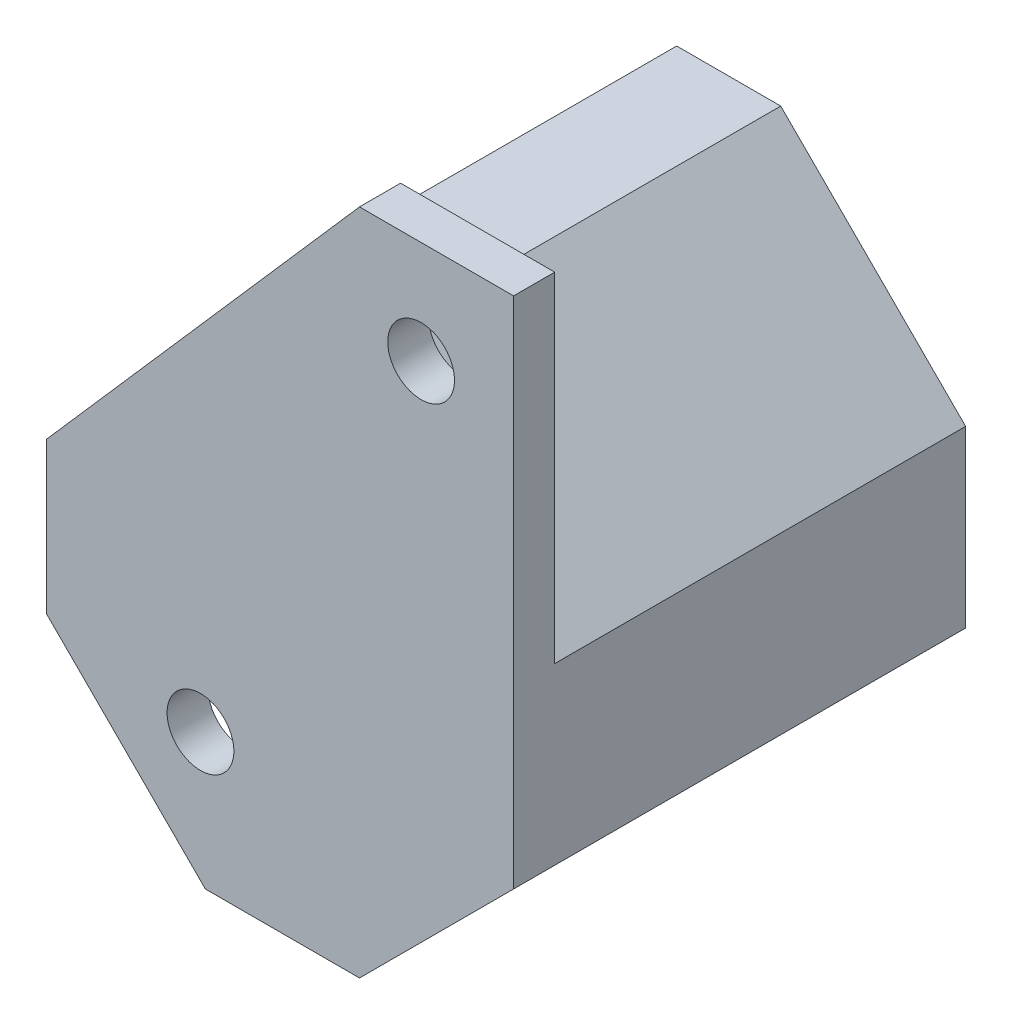
ISO-10303-21;
HEADER;
FILE_DESCRIPTION(('STEP AP214'),'2;1');
FILE_NAME('part.step','',(''),(''),'','','');
FILE_SCHEMA(('AUTOMOTIVE_DESIGN { 1 0 10303 214 1 1 1 1 }'));
ENDSEC;
DATA;
#1=APPLICATION_CONTEXT('core data for automotive mechanical design processes');
#2=APPLICATION_PROTOCOL_DEFINITION('international standard','automotive_design',2000,#1);
#3=PRODUCT_CONTEXT('',#1,'mechanical');
#4=PRODUCT('Part','Part','',(#3));
#5=PRODUCT_RELATED_PRODUCT_CATEGORY('part','',(#4));
#6=PRODUCT_DEFINITION_FORMATION('','',#4);
#7=PRODUCT_DEFINITION_CONTEXT('part definition',#1,'design');
#8=PRODUCT_DEFINITION('design','',#6,#7);
#9=PRODUCT_DEFINITION_SHAPE('','',#8);
#10=(LENGTH_UNIT() NAMED_UNIT(*) SI_UNIT(.MILLI.,.METRE.));
#11=(NAMED_UNIT(*) PLANE_ANGLE_UNIT() SI_UNIT($,.RADIAN.));
#12=(NAMED_UNIT(*) SI_UNIT($,.STERADIAN.) SOLID_ANGLE_UNIT());
#13=UNCERTAINTY_MEASURE_WITH_UNIT(LENGTH_MEASURE(1.E-05),#10,'distance_accuracy_value','');
#14=(GEOMETRIC_REPRESENTATION_CONTEXT(3) GLOBAL_UNCERTAINTY_ASSIGNED_CONTEXT((#13)) GLOBAL_UNIT_ASSIGNED_CONTEXT((#10,
#11,#12)) REPRESENTATION_CONTEXT('',''));
#15=CARTESIAN_POINT('',(0.,0.,0.));
#16=DIRECTION('',(0.,0.,1.));
#17=DIRECTION('',(1.,0.,0.));
#18=AXIS2_PLACEMENT_3D('',#15,#16,#17);
#19=CARTESIAN_POINT('',(-13.841173909257,-78.8343739809079,4.));
#20=DIRECTION('',(0.,-1.,0.));
#21=DIRECTION('',(0.,0.,1.));
#22=AXIS2_PLACEMENT_3D('',#19,#20,#21);
#23=PLANE('',#22);
#24=DIRECTION('',(0.,0.,-1.));
#25=VECTOR('',#24,1.);
#26=CARTESIAN_POINT('',(21.158826090743,-78.8343739809079,4.));
#27=LINE('',#26,#25);
#28=CARTESIAN_POINT('',(21.158826090743,-78.8343739809079,4.));
#29=VERTEX_POINT('',#28);
#30=CARTESIAN_POINT('',(21.158826090743,-78.8343739809079,0.));
#31=VERTEX_POINT('',#30);
#32=EDGE_CURVE('E385',#29,#31,#27,.T.);
#33=ORIENTED_EDGE('',*,*,#32,.F.);
#34=DIRECTION('',(1.,0.,0.));
#35=VECTOR('',#34,1.);
#36=CARTESIAN_POINT('',(-13.841173909257,-78.8343739809079,4.));
#37=LINE('',#36,#35);
#38=CARTESIAN_POINT('',(6.15882609074331,-78.8343739809079,4.));
#39=VERTEX_POINT('',#38);
#40=EDGE_CURVE('E355',#39,#29,#37,.T.);
#41=ORIENTED_EDGE('',*,*,#40,.F.);
#42=DIRECTION('',(0.,0.,1.));
#43=VECTOR('',#42,1.);
#44=CARTESIAN_POINT('',(6.15882609074331,-78.8343739809079,4.));
#45=LINE('',#44,#43);
#46=CARTESIAN_POINT('',(6.15882609074331,-78.8343739809079,0.));
#47=VERTEX_POINT('',#46);
#48=EDGE_CURVE('E369',#47,#39,#45,.T.);
#49=ORIENTED_EDGE('',*,*,#48,.F.);
#50=DIRECTION('',(-1.,0.,0.));
#51=VECTOR('',#50,1.);
#52=CARTESIAN_POINT('',(-13.841173909257,-78.8343739809079,0.));
#53=LINE('',#52,#51);
#54=EDGE_CURVE('E237',#31,#47,#53,.T.);
#55=ORIENTED_EDGE('',*,*,#54,.F.);
#56=EDGE_LOOP('',(#33,#41,#49,#55));
#57=FACE_BOUND('',#56,.T.);
#58=ADVANCED_FACE('F35',(#57),#23,.T.);
#59=CARTESIAN_POINT('',(-13.841173909257,-58.8343739809077,4.));
#60=DIRECTION('',(0.707106781186544,0.707106781186551,0.));
#61=DIRECTION('',(0.,0.,-1.));
#62=AXIS2_PLACEMENT_3D('',#59,#60,#61);
#63=PLANE('',#62);
#64=DIRECTION('',(0.,0.,1.));
#65=VECTOR('',#64,1.);
#66=CARTESIAN_POINT('',(-9.32054189023436,-63.3550059999304,4.));
#67=LINE('',#66,#65);
#68=CARTESIAN_POINT('',(-9.32054189023436,-63.3550059999304,4.));
#69=VERTEX_POINT('',#68);
#70=CARTESIAN_POINT('',(-9.32054189023436,-63.3550059999304,0.));
#71=VERTEX_POINT('',#70);
#72=EDGE_CURVE('E207',#69,#71,#67,.F.);
#73=ORIENTED_EDGE('',*,*,#72,.T.);
#74=DIRECTION('',(0.707106781186551,-0.707106781186544,0.));
#75=VECTOR('',#74,1.);
#76=CARTESIAN_POINT('',(-13.841173909257,-58.8343739809077,0.));
#77=LINE('',#76,#75);
#78=EDGE_CURVE('E245',#47,#71,#77,.F.);
#79=ORIENTED_EDGE('',*,*,#78,.F.);
#80=ORIENTED_EDGE('',*,*,#48,.T.);
#81=DIRECTION('',(0.707106781186551,-0.707106781186544,0.));
#82=VECTOR('',#81,1.);
#83=CARTESIAN_POINT('',(-13.841173909257,-58.8343739809077,4.));
#84=LINE('',#83,#82);
#85=EDGE_CURVE('E374',#39,#69,#84,.F.);
#86=ORIENTED_EDGE('',*,*,#85,.T.);
#87=EDGE_LOOP('',(#73,#79,#80,#86));
#88=FACE_BOUND('',#87,.T.);
#89=ADVANCED_FACE('F413',(#88),#63,.F.);
#90=CARTESIAN_POINT('',(21.158826090743,-13.8343739809079,4.));
#91=DIRECTION('',(-0.752576694706878,0.658504607868518,0.));
#92=DIRECTION('',(0.658504607868518,0.752576694706878,0.));
#93=AXIS2_PLACEMENT_3D('',#90,#91,#92);
#94=PLANE('',#93);
#95=DIRECTION('',(0.,0.,1.));
#96=VECTOR('',#95,1.);
#97=CARTESIAN_POINT('',(-9.32054189023436,-48.6679373877391,4.));
#98=LINE('',#97,#96);
#99=CARTESIAN_POINT('',(-9.32054189023436,-48.6679373877391,-40.));
#100=VERTEX_POINT('',#99);
#101=CARTESIAN_POINT('',(-9.32054189023436,-48.6679373877391,4.));
#102=VERTEX_POINT('',#101);
#103=EDGE_CURVE('E205',#100,#102,#98,.T.);
#104=ORIENTED_EDGE('',*,*,#103,.T.);
#105=DIRECTION('',(-0.658504607868518,-0.752576694706878,0.));
#106=VECTOR('',#105,1.);
#107=CARTESIAN_POINT('',(21.158826090743,-13.8343739809079,4.));
#108=LINE('',#107,#106);
#109=CARTESIAN_POINT('',(21.158826090743,-13.8343739809079,4.));
#110=VERTEX_POINT('',#109);
#111=EDGE_CURVE('E214',#110,#102,#108,.T.);
#112=ORIENTED_EDGE('',*,*,#111,.F.);
#113=DIRECTION('',(0.,0.,-1.));
#114=VECTOR('',#113,1.);
#115=CARTESIAN_POINT('',(21.158826090743,-13.8343739809079,4.));
#116=LINE('',#115,#114);
#117=CARTESIAN_POINT('',(21.158826090743,-13.8343739809079,0.));
#118=VERTEX_POINT('',#117);
#119=EDGE_CURVE('E367',#110,#118,#116,.T.);
#120=ORIENTED_EDGE('',*,*,#119,.T.);
#121=DIRECTION('',(-0.658504607868518,-0.752576694706878,0.));
#122=VECTOR('',#121,1.);
#123=CARTESIAN_POINT('',(21.158826090743,-13.8343739809079,0.));
#124=LINE('',#123,#122);
#125=CARTESIAN_POINT('',(8.03382609074297,-28.8343739809079,0.));
#126=VERTEX_POINT('',#125);
#127=EDGE_CURVE('E359',#118,#126,#124,.T.);
#128=ORIENTED_EDGE('',*,*,#127,.T.);
#129=DIRECTION('',(0.,0.,1.));
#130=VECTOR('',#129,1.);
#131=CARTESIAN_POINT('',(8.03382609074297,-28.8343739809079,-40.));
#132=LINE('',#131,#130);
#133=CARTESIAN_POINT('',(8.03382609074297,-28.8343739809079,-40.));
#134=VERTEX_POINT('',#133);
#135=EDGE_CURVE('E350',#134,#126,#132,.T.);
#136=ORIENTED_EDGE('',*,*,#135,.F.);
#137=DIRECTION('',(-0.658504607868518,-0.752576694706877,0.));
#138=VECTOR('',#137,1.);
#139=CARTESIAN_POINT('',(8.03382609074297,-28.8343739809079,-40.));
#140=LINE('',#139,#138);
#141=EDGE_CURVE('E228',#134,#100,#140,.T.);
#142=ORIENTED_EDGE('',*,*,#141,.T.);
#143=EDGE_LOOP('',(#104,#112,#120,#128,#136,#142));
#144=FACE_BOUND('',#143,.T.);
#145=CARTESIAN_POINT('',(-3.19509644070261,-41.66742830256,-26.));
#146=DIRECTION('',(0.752576694706878,-0.658504607868518,0.));
#147=DIRECTION('',(-0.658504607868518,-0.752576694706878,0.));
#148=AXIS2_PLACEMENT_3D('',#145,#146,#147);
#149=ELLIPSE('',#148,5.58082655168537,4.19999999999976);
#150=CARTESIAN_POINT('',(-6.87009644070241,-45.8674283025597,-26.));
#151=VERTEX_POINT('',#150);
#152=EDGE_CURVE('E342',#151,#151,#149,.T.);
#153=ORIENTED_EDGE('',*,*,#152,.T.);
#154=EDGE_LOOP('',(#153));
#155=FACE_BOUND('',#154,.T.);
#156=ADVANCED_FACE('F224',(#144,#155),#94,.T.);
#157=CARTESIAN_POINT('',(36.158826090743,-13.8343739809079,4.));
#158=DIRECTION('',(0.,1.,0.));
#159=DIRECTION('',(0.,0.,-1.));
#160=AXIS2_PLACEMENT_3D('',#157,#158,#159);
#161=PLANE('',#160);
#162=DIRECTION('',(-1.,0.,0.));
#163=VECTOR('',#162,1.);
#164=CARTESIAN_POINT('',(36.158826090743,-13.8343739809079,0.));
#165=LINE('',#164,#163);
#166=CARTESIAN_POINT('',(36.158826090743,-13.8343739809079,0.));
#167=VERTEX_POINT('',#166);
#168=EDGE_CURVE('E363',#167,#118,#165,.T.);
#169=ORIENTED_EDGE('',*,*,#168,.T.);
#170=ORIENTED_EDGE('',*,*,#119,.F.);
#171=DIRECTION('',(-1.,0.,0.));
#172=VECTOR('',#171,1.);
#173=CARTESIAN_POINT('',(36.158826090743,-13.8343739809079,4.));
#174=LINE('',#173,#172);
#175=CARTESIAN_POINT('',(36.158826090743,-13.8343739809079,4.));
#176=VERTEX_POINT('',#175);
#177=EDGE_CURVE('E217',#176,#110,#174,.T.);
#178=ORIENTED_EDGE('',*,*,#177,.F.);
#179=DIRECTION('',(0.,0.,-1.));
#180=VECTOR('',#179,1.);
#181=CARTESIAN_POINT('',(36.158826090743,-13.8343739809079,4.));
#182=LINE('',#181,#180);
#183=EDGE_CURVE('E221',#176,#167,#182,.T.);
#184=ORIENTED_EDGE('',*,*,#183,.T.);
#185=EDGE_LOOP('',(#169,#170,#178,#184));
#186=FACE_BOUND('',#185,.T.);
#187=ADVANCED_FACE('F734',(#186),#161,.T.);
#188=CARTESIAN_POINT('',(36.158826090743,-78.8343739809079,4.));
#189=DIRECTION('',(1.,0.,0.));
#190=DIRECTION('',(0.,0.,-1.));
#191=AXIS2_PLACEMENT_3D('',#188,#189,#190);
#192=PLANE('',#191);
#193=DIRECTION('',(0.,1.,0.));
#194=VECTOR('',#193,1.);
#195=CARTESIAN_POINT('',(36.158826090743,-78.8343739809079,-40.));
#196=LINE('',#195,#194);
#197=CARTESIAN_POINT('',(36.158826090743,-63.8343739809078,-40.));
#198=VERTEX_POINT('',#197);
#199=CARTESIAN_POINT('',(36.158826090743,-46.8343739809079,-40.));
#200=VERTEX_POINT('',#199);
#201=EDGE_CURVE('E344',#198,#200,#196,.T.);
#202=ORIENTED_EDGE('',*,*,#201,.T.);
#203=DIRECTION('',(0.,0.,-1.));
#204=VECTOR('',#203,1.);
#205=CARTESIAN_POINT('',(36.158826090743,-46.8343739809079,-40.));
#206=LINE('',#205,#204);
#207=CARTESIAN_POINT('',(36.158826090743,-46.8343739809079,0.));
#208=VERTEX_POINT('',#207);
#209=EDGE_CURVE('E378',#208,#200,#206,.T.);
#210=ORIENTED_EDGE('',*,*,#209,.F.);
#211=DIRECTION('',(0.,1.,0.));
#212=VECTOR('',#211,1.);
#213=CARTESIAN_POINT('',(36.158826090743,-78.8343739809079,0.));
#214=LINE('',#213,#212);
#215=EDGE_CURVE('E354',#208,#167,#214,.T.);
#216=ORIENTED_EDGE('',*,*,#215,.T.);
#217=ORIENTED_EDGE('',*,*,#183,.F.);
#218=DIRECTION('',(0.,1.,0.));
#219=VECTOR('',#218,1.);
#220=CARTESIAN_POINT('',(36.158826090743,-78.8343739809079,4.));
#221=LINE('',#220,#219);
#222=CARTESIAN_POINT('',(36.158826090743,-63.8343739809078,4.));
#223=VERTEX_POINT('',#222);
#224=EDGE_CURVE('E358',#223,#176,#221,.T.);
#225=ORIENTED_EDGE('',*,*,#224,.F.);
#226=DIRECTION('',(0.,0.,1.));
#227=VECTOR('',#226,1.);
#228=CARTESIAN_POINT('',(36.158826090743,-63.8343739809078,4.));
#229=LINE('',#228,#227);
#230=EDGE_CURVE('E390',#198,#223,#229,.T.);
#231=ORIENTED_EDGE('',*,*,#230,.F.);
#232=EDGE_LOOP('',(#202,#210,#216,#217,#225,#231));
#233=FACE_BOUND('',#232,.T.);
#234=ADVANCED_FACE('F423',(#233),#192,.T.);
#235=CARTESIAN_POINT('',(0.,-57.6687479618158,4.));
#236=DIRECTION('',(0.,0.,-1.));
#237=DIRECTION('',(-1.,0.,0.));
#238=AXIS2_PLACEMENT_3D('',#235,#236,#237);
#239=PLANE('',#238);
#240=CARTESIAN_POINT('',(27.158826090743,-23.8343739809079,4.));
#241=DIRECTION('',(0.,0.,1.));
#242=DIRECTION('',(-1.,0.,0.));
#243=AXIS2_PLACEMENT_3D('',#240,#241,#242);
#244=CIRCLE('',#243,3.25);
#245=CARTESIAN_POINT('',(23.908826090743,-23.8343739809079,4.));
#246=VERTEX_POINT('',#245);
#247=EDGE_CURVE('E464',#246,#246,#244,.T.);
#248=ORIENTED_EDGE('',*,*,#247,.F.);
#249=EDGE_LOOP('',(#248));
#250=FACE_BOUND('',#249,.T.);
#251=CARTESIAN_POINT('',(5.67945810976564,-65.8343739809079,4.));
#252=DIRECTION('',(0.,0.,1.));
#253=DIRECTION('',(-1.,0.,0.));
#254=AXIS2_PLACEMENT_3D('',#251,#252,#253);
#255=CIRCLE('',#254,3.25);
#256=CARTESIAN_POINT('',(2.42945810976564,-65.8343739809079,4.));
#257=VERTEX_POINT('',#256);
#258=EDGE_CURVE('E473',#257,#257,#255,.T.);
#259=ORIENTED_EDGE('',*,*,#258,.F.);
#260=EDGE_LOOP('',(#259));
#261=FACE_BOUND('',#260,.T.);
#262=ORIENTED_EDGE('',*,*,#85,.F.);
#263=ORIENTED_EDGE('',*,*,#40,.T.);
#264=DIRECTION('',(0.707106781186546,0.707106781186549,0.));
#265=VECTOR('',#264,1.);
#266=CARTESIAN_POINT('',(21.158826090743,-78.8343739809079,4.));
#267=LINE('',#266,#265);
#268=EDGE_CURVE('E43',#223,#29,#267,.F.);
#269=ORIENTED_EDGE('',*,*,#268,.F.);
#270=ORIENTED_EDGE('',*,*,#224,.T.);
#271=ORIENTED_EDGE('',*,*,#177,.T.);
#272=ORIENTED_EDGE('',*,*,#111,.T.);
#273=DIRECTION('',(0.,-1.,0.));
#274=VECTOR('',#273,1.);
#275=CARTESIAN_POINT('',(-9.32054189023436,-64.5211497813229,4.));
#276=LINE('',#275,#274);
#277=EDGE_CURVE('E200',#102,#69,#276,.T.);
#278=ORIENTED_EDGE('',*,*,#277,.T.);
#279=EDGE_LOOP('',(#262,#263,#269,#270,#271,#272,#278));
#280=FACE_BOUND('',#279,.T.);
#281=ADVANCED_FACE('F215',(#250,#261,#280),#239,.F.);
#282=CARTESIAN_POINT('',(0.,-57.6687479618158,0.));
#283=DIRECTION('',(0.,0.,-1.));
#284=DIRECTION('',(-1.,0.,0.));
#285=AXIS2_PLACEMENT_3D('',#282,#283,#284);
#286=PLANE('',#285);
#287=CARTESIAN_POINT('',(27.158826090743,-23.8343739809079,0.));
#288=DIRECTION('',(0.,0.,1.));
#289=DIRECTION('',(-1.,0.,0.));
#290=AXIS2_PLACEMENT_3D('',#287,#288,#289);
#291=CIRCLE('',#290,3.25);
#292=CARTESIAN_POINT('',(23.908826090743,-23.8343739809079,0.));
#293=VERTEX_POINT('',#292);
#294=EDGE_CURVE('E467',#293,#293,#291,.T.);
#295=ORIENTED_EDGE('',*,*,#294,.T.);
#296=EDGE_LOOP('',(#295));
#297=FACE_BOUND('',#296,.T.);
#298=DIRECTION('',(-1.,0.,0.));
#299=VECTOR('',#298,1.);
#300=CARTESIAN_POINT('',(36.158826090743,-28.8343739809079,0.));
#301=LINE('',#300,#299);
#302=CARTESIAN_POINT('',(18.158826090743,-28.8343739809079,0.));
#303=VERTEX_POINT('',#302);
#304=EDGE_CURVE('E345',#303,#126,#301,.T.);
#305=ORIENTED_EDGE('',*,*,#304,.T.);
#306=ORIENTED_EDGE('',*,*,#127,.F.);
#307=ORIENTED_EDGE('',*,*,#168,.F.);
#308=ORIENTED_EDGE('',*,*,#215,.F.);
#309=DIRECTION('',(0.707106781186546,-0.707106781186549,0.));
#310=VECTOR('',#309,1.);
#311=CARTESIAN_POINT('',(18.158826090743,-28.8343739809079,0.));
#312=LINE('',#311,#310);
#313=EDGE_CURVE('E383',#303,#208,#312,.T.);
#314=ORIENTED_EDGE('',*,*,#313,.F.);
#315=EDGE_LOOP('',(#305,#306,#307,#308,#314));
#316=FACE_BOUND('',#315,.T.);
#317=ADVANCED_FACE('F448',(#297,#316),#286,.T.);
#318=CARTESIAN_POINT('',(36.158826090743,-28.8343739809079,-40.));
#319=DIRECTION('',(0.,-1.,0.));
#320=DIRECTION('',(0.,0.,1.));
#321=AXIS2_PLACEMENT_3D('',#318,#319,#320);
#322=PLANE('',#321);
#323=DIRECTION('',(-1.,0.,0.));
#324=VECTOR('',#323,1.);
#325=CARTESIAN_POINT('',(36.158826090743,-28.8343739809079,-40.));
#326=LINE('',#325,#324);
#327=CARTESIAN_POINT('',(18.158826090743,-28.8343739809079,-40.));
#328=VERTEX_POINT('',#327);
#329=EDGE_CURVE('E348',#328,#134,#326,.T.);
#330=ORIENTED_EDGE('',*,*,#329,.T.);
#331=ORIENTED_EDGE('',*,*,#135,.T.);
#332=ORIENTED_EDGE('',*,*,#304,.F.);
#333=DIRECTION('',(0.,0.,1.));
#334=VECTOR('',#333,1.);
#335=CARTESIAN_POINT('',(18.158826090743,-28.8343739809079,0.));
#336=LINE('',#335,#334);
#337=EDGE_CURVE('E376',#328,#303,#336,.T.);
#338=ORIENTED_EDGE('',*,*,#337,.F.);
#339=EDGE_LOOP('',(#330,#331,#332,#338));
#340=FACE_BOUND('',#339,.T.);
#341=ADVANCED_FACE('F434',(#340),#322,.F.);
#342=CARTESIAN_POINT('',(0.,-57.6687479618158,-40.));
#343=DIRECTION('',(0.,0.,-1.));
#344=DIRECTION('',(-1.,0.,0.));
#345=AXIS2_PLACEMENT_3D('',#342,#343,#344);
#346=PLANE('',#345);
#347=DIRECTION('',(0.,1.,0.));
#348=VECTOR('',#347,1.);
#349=CARTESIAN_POINT('',(-9.32054189023436,-64.5211497813229,-40.));
#350=LINE('',#349,#348);
#351=CARTESIAN_POINT('',(-9.32054189023436,-53.8343739809079,-40.));
#352=VERTEX_POINT('',#351);
#353=EDGE_CURVE('E211',#352,#100,#350,.T.);
#354=ORIENTED_EDGE('',*,*,#353,.T.);
#355=ORIENTED_EDGE('',*,*,#141,.F.);
#356=ORIENTED_EDGE('',*,*,#329,.F.);
#357=DIRECTION('',(-0.707106781186546,0.707106781186549,0.));
#358=VECTOR('',#357,1.);
#359=CARTESIAN_POINT('',(23.4966000358255,-34.1721479259904,-40.));
#360=LINE('',#359,#358);
#361=EDGE_CURVE('E381',#200,#328,#360,.T.);
#362=ORIENTED_EDGE('',*,*,#361,.F.);
#363=ORIENTED_EDGE('',*,*,#201,.F.);
#364=DIRECTION('',(-0.707106781186546,-0.707106781186549,0.));
#365=VECTOR('',#364,1.);
#366=CARTESIAN_POINT('',(21.1622260549176,-78.8309740167333,-40.));
#367=LINE('',#366,#365);
#368=CARTESIAN_POINT('',(26.924663750532,-73.0685363211188,-40.));
#369=VERTEX_POINT('',#368);
#370=EDGE_CURVE('E388',#369,#198,#367,.F.);
#371=ORIENTED_EDGE('',*,*,#370,.F.);
#372=DIRECTION('',(-0.707106781186547,0.707106781186548,0.));
#373=VECTOR('',#372,1.);
#374=CARTESIAN_POINT('',(26.924663750532,-73.0685363211188,-40.));
#375=LINE('',#374,#373);
#376=CARTESIAN_POINT('',(7.69050141032104,-53.8343739809079,-40.));
#377=VERTEX_POINT('',#376);
#378=EDGE_CURVE('E232',#369,#377,#375,.T.);
#379=ORIENTED_EDGE('',*,*,#378,.T.);
#380=DIRECTION('',(-1.,0.,0.));
#381=VECTOR('',#380,1.);
#382=CARTESIAN_POINT('',(7.69050141032104,-53.8343739809079,-40.));
#383=LINE('',#382,#381);
#384=EDGE_CURVE('E229',#377,#352,#383,.T.);
#385=ORIENTED_EDGE('',*,*,#384,.T.);
#386=EDGE_LOOP('',(#354,#355,#356,#362,#363,#371,#379,#385));
#387=FACE_BOUND('',#386,.T.);
#388=DIRECTION('',(0.866025403784439,-0.5,0.));
#389=VECTOR('',#388,1.);
#390=CARTESIAN_POINT('',(21.958826090743,-57.2592451115043,-40.));
#391=LINE('',#390,#389);
#392=CARTESIAN_POINT('',(21.958826090743,-57.2592451115043,-40.));
#393=VERTEX_POINT('',#392);
#394=CARTESIAN_POINT('',(26.158826090743,-59.6841162421007,-40.));
#395=VERTEX_POINT('',#394);
#396=EDGE_CURVE('E253',#393,#395,#391,.T.);
#397=ORIENTED_EDGE('',*,*,#396,.T.);
#398=DIRECTION('',(0.866025403784439,0.5,0.));
#399=VECTOR('',#398,1.);
#400=CARTESIAN_POINT('',(26.158826090743,-59.6841162421007,-40.));
#401=LINE('',#400,#399);
#402=CARTESIAN_POINT('',(30.358826090743,-57.2592451115043,-40.));
#403=VERTEX_POINT('',#402);
#404=EDGE_CURVE('E271',#395,#403,#401,.T.);
#405=ORIENTED_EDGE('',*,*,#404,.T.);
#406=DIRECTION('',(0.,1.,0.));
#407=VECTOR('',#406,1.);
#408=CARTESIAN_POINT('',(30.358826090743,-57.2592451115043,-40.));
#409=LINE('',#408,#407);
#410=CARTESIAN_POINT('',(30.358826090743,-52.4095028503114,-40.));
#411=VERTEX_POINT('',#410);
#412=EDGE_CURVE('E274',#403,#411,#409,.T.);
#413=ORIENTED_EDGE('',*,*,#412,.T.);
#414=DIRECTION('',(-0.866025403784439,0.5,0.));
#415=VECTOR('',#414,1.);
#416=CARTESIAN_POINT('',(30.358826090743,-52.4095028503114,-40.));
#417=LINE('',#416,#415);
#418=CARTESIAN_POINT('',(26.158826090743,-49.984631719715,-40.));
#419=VERTEX_POINT('',#418);
#420=EDGE_CURVE('E277',#411,#419,#417,.T.);
#421=ORIENTED_EDGE('',*,*,#420,.T.);
#422=DIRECTION('',(-0.866025403784439,-0.5,0.));
#423=VECTOR('',#422,1.);
#424=CARTESIAN_POINT('',(26.158826090743,-49.984631719715,-40.));
#425=LINE('',#424,#423);
#426=CARTESIAN_POINT('',(21.958826090743,-52.4095028503114,-40.));
#427=VERTEX_POINT('',#426);
#428=EDGE_CURVE('E280',#419,#427,#425,.T.);
#429=ORIENTED_EDGE('',*,*,#428,.T.);
#430=DIRECTION('',(0.,-1.,0.));
#431=VECTOR('',#430,1.);
#432=CARTESIAN_POINT('',(21.958826090743,-52.4095028503114,-40.));
#433=LINE('',#432,#431);
#434=EDGE_CURVE('E258',#427,#393,#433,.T.);
#435=ORIENTED_EDGE('',*,*,#434,.T.);
#436=EDGE_LOOP('',(#397,#405,#413,#421,#429,#435));
#437=FACE_BOUND('',#436,.T.);
#438=DIRECTION('',(0.866025403784438,-0.5,0.));
#439=VECTOR('',#438,1.);
#440=CARTESIAN_POINT('',(5.95882609074296,-42.2592451115043,-40.));
#441=LINE('',#440,#439);
#442=CARTESIAN_POINT('',(5.95882609074296,-42.2592451115043,-40.));
#443=VERTEX_POINT('',#442);
#444=CARTESIAN_POINT('',(10.158826090743,-44.6841162421007,-40.));
#445=VERTEX_POINT('',#444);
#446=EDGE_CURVE('E287',#443,#445,#441,.T.);
#447=ORIENTED_EDGE('',*,*,#446,.T.);
#448=DIRECTION('',(0.866025403784439,0.5,0.));
#449=VECTOR('',#448,1.);
#450=CARTESIAN_POINT('',(10.158826090743,-44.6841162421007,-40.));
#451=LINE('',#450,#449);
#452=CARTESIAN_POINT('',(14.358826090743,-42.2592451115043,-40.));
#453=VERTEX_POINT('',#452);
#454=EDGE_CURVE('E314',#445,#453,#451,.T.);
#455=ORIENTED_EDGE('',*,*,#454,.T.);
#456=DIRECTION('',(0.,1.,0.));
#457=VECTOR('',#456,1.);
#458=CARTESIAN_POINT('',(14.358826090743,-42.2592451115043,-40.));
#459=LINE('',#458,#457);
#460=CARTESIAN_POINT('',(14.358826090743,-37.4095028503114,-40.));
#461=VERTEX_POINT('',#460);
#462=EDGE_CURVE('E317',#453,#461,#459,.T.);
#463=ORIENTED_EDGE('',*,*,#462,.T.);
#464=DIRECTION('',(-0.866025403784439,0.5,0.));
#465=VECTOR('',#464,1.);
#466=CARTESIAN_POINT('',(14.358826090743,-37.4095028503114,-40.));
#467=LINE('',#466,#465);
#468=CARTESIAN_POINT('',(10.158826090743,-34.984631719715,-40.));
#469=VERTEX_POINT('',#468);
#470=EDGE_CURVE('E320',#461,#469,#467,.T.);
#471=ORIENTED_EDGE('',*,*,#470,.T.);
#472=DIRECTION('',(-0.866025403784439,-0.5,0.));
#473=VECTOR('',#472,1.);
#474=CARTESIAN_POINT('',(10.158826090743,-34.984631719715,-40.));
#475=LINE('',#474,#473);
#476=CARTESIAN_POINT('',(5.95882609074296,-37.4095028503114,-40.));
#477=VERTEX_POINT('',#476);
#478=EDGE_CURVE('E323',#469,#477,#475,.T.);
#479=ORIENTED_EDGE('',*,*,#478,.T.);
#480=DIRECTION('',(0.,-1.,0.));
#481=VECTOR('',#480,1.);
#482=CARTESIAN_POINT('',(5.95882609074296,-37.4095028503114,-40.));
#483=LINE('',#482,#481);
#484=EDGE_CURVE('E301',#477,#443,#483,.T.);
#485=ORIENTED_EDGE('',*,*,#484,.T.);
#486=EDGE_LOOP('',(#447,#455,#463,#471,#479,#485));
#487=FACE_BOUND('',#486,.T.);
#488=ADVANCED_FACE('F427',(#387,#437,#487),#346,.T.);
#489=CARTESIAN_POINT('',(18.158826090743,-28.8343739809079,-40.));
#490=DIRECTION('',(0.707106781186549,0.707106781186546,0.));
#491=DIRECTION('',(0.,0.,-1.));
#492=AXIS2_PLACEMENT_3D('',#489,#490,#491);
#493=PLANE('',#492);
#494=ORIENTED_EDGE('',*,*,#361,.T.);
#495=ORIENTED_EDGE('',*,*,#337,.T.);
#496=ORIENTED_EDGE('',*,*,#313,.T.);
#497=ORIENTED_EDGE('',*,*,#209,.T.);
#498=EDGE_LOOP('',(#494,#495,#496,#497));
#499=FACE_BOUND('',#498,.T.);
#500=ADVANCED_FACE('F425',(#499),#493,.T.);
#501=CARTESIAN_POINT('',(21.158826090743,-78.8343739809079,4.));
#502=DIRECTION('',(-0.707106781186549,0.707106781186546,0.));
#503=DIRECTION('',(0.,0.,-1.));
#504=AXIS2_PLACEMENT_3D('',#501,#502,#503);
#505=PLANE('',#504);
#506=DIRECTION('',(0.,0.,-1.));
#507=VECTOR('',#506,1.);
#508=CARTESIAN_POINT('',(26.924663750532,-73.0685363211188,47.8210572876037));
#509=LINE('',#508,#507);
#510=CARTESIAN_POINT('',(26.924663750532,-73.0685363211188,0.));
#511=VERTEX_POINT('',#510);
#512=EDGE_CURVE('E249',#511,#369,#509,.T.);
#513=ORIENTED_EDGE('',*,*,#512,.T.);
#514=ORIENTED_EDGE('',*,*,#370,.T.);
#515=ORIENTED_EDGE('',*,*,#230,.T.);
#516=ORIENTED_EDGE('',*,*,#268,.T.);
#517=ORIENTED_EDGE('',*,*,#32,.T.);
#518=DIRECTION('',(-0.707106781186546,-0.707106781186549,0.));
#519=VECTOR('',#518,1.);
#520=CARTESIAN_POINT('',(21.158826090743,-78.8343739809079,0.));
#521=LINE('',#520,#519);
#522=EDGE_CURVE('E56',#511,#31,#521,.T.);
#523=ORIENTED_EDGE('',*,*,#522,.F.);
#524=EDGE_LOOP('',(#513,#514,#515,#516,#517,#523));
#525=FACE_BOUND('',#524,.T.);
#526=ADVANCED_FACE('F37',(#525),#505,.F.);
#527=CARTESIAN_POINT('',(16.158826090743,-41.66742830256,-26.));
#528=DIRECTION('',(-1.,0.,0.));
#529=DIRECTION('',(0.,0.,1.));
#530=AXIS2_PLACEMENT_3D('',#527,#528,#529);
#531=CYLINDRICAL_SURFACE('',#530,4.19999999999976);
#532=ORIENTED_EDGE('',*,*,#152,.F.);
#533=EDGE_LOOP('',(#532));
#534=FACE_BOUND('',#533,.T.);
#535=CARTESIAN_POINT('',(16.158826090743,-41.66742830256,-26.));
#536=DIRECTION('',(1.,0.,0.));
#537=DIRECTION('',(0.,0.,1.));
#538=AXIS2_PLACEMENT_3D('',#535,#536,#537);
#539=CIRCLE('',#538,4.19999999999976);
#540=CARTESIAN_POINT('',(16.158826090743,-41.66742830256,-21.8000000000002));
#541=VERTEX_POINT('',#540);
#542=EDGE_CURVE('E330',#541,#541,#539,.T.);
#543=ORIENTED_EDGE('',*,*,#542,.T.);
#544=EDGE_LOOP('',(#543));
#545=FACE_BOUND('',#544,.T.);
#546=ADVANCED_FACE('F396',(#534,#545),#531,.F.);
#547=CARTESIAN_POINT('',(16.158826090743,-41.66742830256,-26.));
#548=DIRECTION('',(-1.,0.,0.));
#549=DIRECTION('',(0.,0.,1.));
#550=AXIS2_PLACEMENT_3D('',#547,#548,#549);
#551=PLANE('',#550);
#552=ORIENTED_EDGE('',*,*,#542,.F.);
#553=EDGE_LOOP('',(#552));
#554=FACE_BOUND('',#553,.T.);
#555=ADVANCED_FACE('F399',(#554),#551,.T.);
#556=CARTESIAN_POINT('',(5.95882609074296,-42.2592451115043,-35.));
#557=DIRECTION('',(-0.5,-0.866025403784438,0.));
#558=DIRECTION('',(-0.866025403784439,0.5,0.));
#559=AXIS2_PLACEMENT_3D('',#556,#557,#558);
#560=PLANE('',#559);
#561=ORIENTED_EDGE('',*,*,#446,.F.);
#562=DIRECTION('',(0.,0.,-1.));
#563=VECTOR('',#562,1.);
#564=CARTESIAN_POINT('',(5.95882609074296,-42.2592451115043,-35.));
#565=LINE('',#564,#563);
#566=CARTESIAN_POINT('',(5.95882609074296,-42.2592451115043,-35.));
#567=VERTEX_POINT('',#566);
#568=EDGE_CURVE('E328',#567,#443,#565,.T.);
#569=ORIENTED_EDGE('',*,*,#568,.F.);
#570=DIRECTION('',(0.866025403784438,-0.5,0.));
#571=VECTOR('',#570,1.);
#572=CARTESIAN_POINT('',(5.95882609074296,-42.2592451115043,-35.));
#573=LINE('',#572,#571);
#574=CARTESIAN_POINT('',(10.158826090743,-44.6841162421007,-35.));
#575=VERTEX_POINT('',#574);
#576=EDGE_CURVE('E297',#567,#575,#573,.T.);
#577=ORIENTED_EDGE('',*,*,#576,.T.);
#578=DIRECTION('',(0.,0.,-1.));
#579=VECTOR('',#578,1.);
#580=CARTESIAN_POINT('',(10.158826090743,-44.6841162421007,-35.));
#581=LINE('',#580,#579);
#582=EDGE_CURVE('E311',#575,#445,#581,.T.);
#583=ORIENTED_EDGE('',*,*,#582,.T.);
#584=EDGE_LOOP('',(#561,#569,#577,#583));
#585=FACE_BOUND('',#584,.T.);
#586=ADVANCED_FACE('F404',(#585),#560,.F.);
#587=CARTESIAN_POINT('',(5.95882609074296,-37.4095028503114,-35.));
#588=DIRECTION('',(-1.,0.,0.));
#589=DIRECTION('',(0.,0.,1.));
#590=AXIS2_PLACEMENT_3D('',#587,#588,#589);
#591=PLANE('',#590);
#592=ORIENTED_EDGE('',*,*,#484,.F.);
#593=DIRECTION('',(0.,0.,-1.));
#594=VECTOR('',#593,1.);
#595=CARTESIAN_POINT('',(5.95882609074296,-37.4095028503114,-35.));
#596=LINE('',#595,#594);
#597=CARTESIAN_POINT('',(5.95882609074296,-37.4095028503114,-35.));
#598=VERTEX_POINT('',#597);
#599=EDGE_CURVE('E331',#598,#477,#596,.T.);
#600=ORIENTED_EDGE('',*,*,#599,.F.);
#601=DIRECTION('',(0.,-1.,0.));
#602=VECTOR('',#601,1.);
#603=CARTESIAN_POINT('',(5.95882609074296,-37.4095028503114,-35.));
#604=LINE('',#603,#602);
#605=EDGE_CURVE('E309',#598,#567,#604,.T.);
#606=ORIENTED_EDGE('',*,*,#605,.T.);
#607=ORIENTED_EDGE('',*,*,#568,.T.);
#608=EDGE_LOOP('',(#592,#600,#606,#607));
#609=FACE_BOUND('',#608,.T.);
#610=ADVANCED_FACE('F409',(#609),#591,.F.);
#611=CARTESIAN_POINT('',(10.158826090743,-34.984631719715,-35.));
#612=DIRECTION('',(-0.5,0.866025403784439,0.));
#613=DIRECTION('',(0.866025403784439,0.5,0.));
#614=AXIS2_PLACEMENT_3D('',#611,#612,#613);
#615=PLANE('',#614);
#616=ORIENTED_EDGE('',*,*,#478,.F.);
#617=DIRECTION('',(0.,0.,-1.));
#618=VECTOR('',#617,1.);
#619=CARTESIAN_POINT('',(10.158826090743,-34.984631719715,-35.));
#620=LINE('',#619,#618);
#621=CARTESIAN_POINT('',(10.158826090743,-34.984631719715,-35.));
#622=VERTEX_POINT('',#621);
#623=EDGE_CURVE('E333',#622,#469,#620,.T.);
#624=ORIENTED_EDGE('',*,*,#623,.F.);
#625=DIRECTION('',(-0.866025403784439,-0.5,0.));
#626=VECTOR('',#625,1.);
#627=CARTESIAN_POINT('',(10.158826090743,-34.984631719715,-35.));
#628=LINE('',#627,#626);
#629=EDGE_CURVE('E307',#622,#598,#628,.T.);
#630=ORIENTED_EDGE('',*,*,#629,.T.);
#631=ORIENTED_EDGE('',*,*,#599,.T.);
#632=EDGE_LOOP('',(#616,#624,#630,#631));
#633=FACE_BOUND('',#632,.T.);
#634=ADVANCED_FACE('F536',(#633),#615,.F.);
#635=CARTESIAN_POINT('',(14.358826090743,-37.4095028503114,-35.));
#636=DIRECTION('',(0.5,0.866025403784439,0.));
#637=DIRECTION('',(0.866025403784439,-0.5,0.));
#638=AXIS2_PLACEMENT_3D('',#635,#636,#637);
#639=PLANE('',#638);
#640=ORIENTED_EDGE('',*,*,#470,.F.);
#641=DIRECTION('',(0.,0.,-1.));
#642=VECTOR('',#641,1.);
#643=CARTESIAN_POINT('',(14.358826090743,-37.4095028503114,-35.));
#644=LINE('',#643,#642);
#645=CARTESIAN_POINT('',(14.358826090743,-37.4095028503114,-35.));
#646=VERTEX_POINT('',#645);
#647=EDGE_CURVE('E335',#646,#461,#644,.T.);
#648=ORIENTED_EDGE('',*,*,#647,.F.);
#649=DIRECTION('',(-0.866025403784439,0.5,0.));
#650=VECTOR('',#649,1.);
#651=CARTESIAN_POINT('',(14.358826090743,-37.4095028503114,-35.));
#652=LINE('',#651,#650);
#653=EDGE_CURVE('E305',#646,#622,#652,.T.);
#654=ORIENTED_EDGE('',*,*,#653,.T.);
#655=ORIENTED_EDGE('',*,*,#623,.T.);
#656=EDGE_LOOP('',(#640,#648,#654,#655));
#657=FACE_BOUND('',#656,.T.);
#658=ADVANCED_FACE('F540',(#657),#639,.F.);
#659=CARTESIAN_POINT('',(14.358826090743,-42.2592451115043,-35.));
#660=DIRECTION('',(1.,0.,0.));
#661=DIRECTION('',(0.,0.,-1.));
#662=AXIS2_PLACEMENT_3D('',#659,#660,#661);
#663=PLANE('',#662);
#664=ORIENTED_EDGE('',*,*,#462,.F.);
#665=DIRECTION('',(0.,0.,-1.));
#666=VECTOR('',#665,1.);
#667=CARTESIAN_POINT('',(14.358826090743,-42.2592451115043,-35.));
#668=LINE('',#667,#666);
#669=CARTESIAN_POINT('',(14.358826090743,-42.2592451115043,-35.));
#670=VERTEX_POINT('',#669);
#671=EDGE_CURVE('E337',#670,#453,#668,.T.);
#672=ORIENTED_EDGE('',*,*,#671,.F.);
#673=DIRECTION('',(0.,1.,0.));
#674=VECTOR('',#673,1.);
#675=CARTESIAN_POINT('',(14.358826090743,-42.2592451115043,-35.));
#676=LINE('',#675,#674);
#677=EDGE_CURVE('E303',#670,#646,#676,.T.);
#678=ORIENTED_EDGE('',*,*,#677,.T.);
#679=ORIENTED_EDGE('',*,*,#647,.T.);
#680=EDGE_LOOP('',(#664,#672,#678,#679));
#681=FACE_BOUND('',#680,.T.);
#682=ADVANCED_FACE('F544',(#681),#663,.F.);
#683=CARTESIAN_POINT('',(10.158826090743,-44.6841162421007,-35.));
#684=DIRECTION('',(0.5,-0.866025403784439,0.));
#685=DIRECTION('',(-0.866025403784439,-0.5,0.));
#686=AXIS2_PLACEMENT_3D('',#683,#684,#685);
#687=PLANE('',#686);
#688=ORIENTED_EDGE('',*,*,#454,.F.);
#689=ORIENTED_EDGE('',*,*,#582,.F.);
#690=DIRECTION('',(0.866025403784439,0.5,0.));
#691=VECTOR('',#690,1.);
#692=CARTESIAN_POINT('',(10.158826090743,-44.6841162421007,-35.));
#693=LINE('',#692,#691);
#694=EDGE_CURVE('E300',#575,#670,#693,.T.);
#695=ORIENTED_EDGE('',*,*,#694,.T.);
#696=ORIENTED_EDGE('',*,*,#671,.T.);
#697=EDGE_LOOP('',(#688,#689,#695,#696));
#698=FACE_BOUND('',#697,.T.);
#699=ADVANCED_FACE('F532',(#698),#687,.F.);
#700=CARTESIAN_POINT('',(0.,-57.6687479618158,-35.));
#701=DIRECTION('',(0.,0.,-1.));
#702=DIRECTION('',(-1.,0.,0.));
#703=AXIS2_PLACEMENT_3D('',#700,#701,#702);
#704=PLANE('',#703);
#705=ORIENTED_EDGE('',*,*,#576,.F.);
#706=ORIENTED_EDGE('',*,*,#605,.F.);
#707=ORIENTED_EDGE('',*,*,#629,.F.);
#708=ORIENTED_EDGE('',*,*,#653,.F.);
#709=ORIENTED_EDGE('',*,*,#677,.F.);
#710=ORIENTED_EDGE('',*,*,#694,.F.);
#711=EDGE_LOOP('',(#705,#706,#707,#708,#709,#710));
#712=FACE_BOUND('',#711,.T.);
#713=ADVANCED_FACE('F528',(#712),#704,.T.);
#714=CARTESIAN_POINT('',(21.958826090743,-57.2592451115043,-35.));
#715=DIRECTION('',(-0.5,-0.866025403784438,0.));
#716=DIRECTION('',(-0.866025403784439,0.5,0.));
#717=AXIS2_PLACEMENT_3D('',#714,#715,#716);
#718=PLANE('',#717);
#719=ORIENTED_EDGE('',*,*,#396,.F.);
#720=DIRECTION('',(0.,0.,-1.));
#721=VECTOR('',#720,1.);
#722=CARTESIAN_POINT('',(21.958826090743,-57.2592451115043,-35.));
#723=LINE('',#722,#721);
#724=CARTESIAN_POINT('',(21.958826090743,-57.2592451115043,-35.));
#725=VERTEX_POINT('',#724);
#726=EDGE_CURVE('E285',#725,#393,#723,.T.);
#727=ORIENTED_EDGE('',*,*,#726,.F.);
#728=DIRECTION('',(0.866025403784439,-0.5,0.));
#729=VECTOR('',#728,1.);
#730=CARTESIAN_POINT('',(21.958826090743,-57.2592451115043,-35.));
#731=LINE('',#730,#729);
#732=CARTESIAN_POINT('',(26.158826090743,-59.6841162421007,-35.));
#733=VERTEX_POINT('',#732);
#734=EDGE_CURVE('E254',#725,#733,#731,.T.);
#735=ORIENTED_EDGE('',*,*,#734,.T.);
#736=DIRECTION('',(0.,0.,-1.));
#737=VECTOR('',#736,1.);
#738=CARTESIAN_POINT('',(26.158826090743,-59.6841162421007,-35.));
#739=LINE('',#738,#737);
#740=EDGE_CURVE('E268',#733,#395,#739,.T.);
#741=ORIENTED_EDGE('',*,*,#740,.T.);
#742=EDGE_LOOP('',(#719,#727,#735,#741));
#743=FACE_BOUND('',#742,.T.);
#744=ADVANCED_FACE('F510',(#743),#718,.F.);
#745=CARTESIAN_POINT('',(21.958826090743,-52.4095028503114,-35.));
#746=DIRECTION('',(-1.,0.,0.));
#747=DIRECTION('',(0.,0.,1.));
#748=AXIS2_PLACEMENT_3D('',#745,#746,#747);
#749=PLANE('',#748);
#750=ORIENTED_EDGE('',*,*,#434,.F.);
#751=DIRECTION('',(0.,0.,-1.));
#752=VECTOR('',#751,1.);
#753=CARTESIAN_POINT('',(21.958826090743,-52.4095028503114,-35.));
#754=LINE('',#753,#752);
#755=CARTESIAN_POINT('',(21.958826090743,-52.4095028503114,-35.));
#756=VERTEX_POINT('',#755);
#757=EDGE_CURVE('E288',#756,#427,#754,.T.);
#758=ORIENTED_EDGE('',*,*,#757,.F.);
#759=DIRECTION('',(0.,-1.,0.));
#760=VECTOR('',#759,1.);
#761=CARTESIAN_POINT('',(21.958826090743,-52.4095028503114,-35.));
#762=LINE('',#761,#760);
#763=EDGE_CURVE('E266',#756,#725,#762,.T.);
#764=ORIENTED_EDGE('',*,*,#763,.T.);
#765=ORIENTED_EDGE('',*,*,#726,.T.);
#766=EDGE_LOOP('',(#750,#758,#764,#765));
#767=FACE_BOUND('',#766,.T.);
#768=ADVANCED_FACE('F506',(#767),#749,.F.);
#769=CARTESIAN_POINT('',(26.158826090743,-49.984631719715,-35.));
#770=DIRECTION('',(-0.5,0.866025403784439,0.));
#771=DIRECTION('',(0.866025403784439,0.5,0.));
#772=AXIS2_PLACEMENT_3D('',#769,#770,#771);
#773=PLANE('',#772);
#774=ORIENTED_EDGE('',*,*,#428,.F.);
#775=DIRECTION('',(0.,0.,-1.));
#776=VECTOR('',#775,1.);
#777=CARTESIAN_POINT('',(26.158826090743,-49.984631719715,-35.));
#778=LINE('',#777,#776);
#779=CARTESIAN_POINT('',(26.158826090743,-49.984631719715,-35.));
#780=VERTEX_POINT('',#779);
#781=EDGE_CURVE('E290',#780,#419,#778,.T.);
#782=ORIENTED_EDGE('',*,*,#781,.F.);
#783=DIRECTION('',(-0.866025403784439,-0.5,0.));
#784=VECTOR('',#783,1.);
#785=CARTESIAN_POINT('',(26.158826090743,-49.984631719715,-35.));
#786=LINE('',#785,#784);
#787=EDGE_CURVE('E264',#780,#756,#786,.T.);
#788=ORIENTED_EDGE('',*,*,#787,.T.);
#789=ORIENTED_EDGE('',*,*,#757,.T.);
#790=EDGE_LOOP('',(#774,#782,#788,#789));
#791=FACE_BOUND('',#790,.T.);
#792=ADVANCED_FACE('F509',(#791),#773,.F.);
#793=CARTESIAN_POINT('',(30.358826090743,-52.4095028503114,-35.));
#794=DIRECTION('',(0.5,0.866025403784439,0.));
#795=DIRECTION('',(0.866025403784439,-0.5,0.));
#796=AXIS2_PLACEMENT_3D('',#793,#794,#795);
#797=PLANE('',#796);
#798=ORIENTED_EDGE('',*,*,#420,.F.);
#799=DIRECTION('',(0.,0.,-1.));
#800=VECTOR('',#799,1.);
#801=CARTESIAN_POINT('',(30.358826090743,-52.4095028503114,-35.));
#802=LINE('',#801,#800);
#803=CARTESIAN_POINT('',(30.358826090743,-52.4095028503114,-35.));
#804=VERTEX_POINT('',#803);
#805=EDGE_CURVE('E292',#804,#411,#802,.T.);
#806=ORIENTED_EDGE('',*,*,#805,.F.);
#807=DIRECTION('',(-0.866025403784439,0.5,0.));
#808=VECTOR('',#807,1.);
#809=CARTESIAN_POINT('',(30.358826090743,-52.4095028503114,-35.));
#810=LINE('',#809,#808);
#811=EDGE_CURVE('E262',#804,#780,#810,.T.);
#812=ORIENTED_EDGE('',*,*,#811,.T.);
#813=ORIENTED_EDGE('',*,*,#781,.T.);
#814=EDGE_LOOP('',(#798,#806,#812,#813));
#815=FACE_BOUND('',#814,.T.);
#816=ADVANCED_FACE('F514',(#815),#797,.F.);
#817=CARTESIAN_POINT('',(30.358826090743,-57.2592451115043,-35.));
#818=DIRECTION('',(1.,0.,0.));
#819=DIRECTION('',(0.,0.,-1.));
#820=AXIS2_PLACEMENT_3D('',#817,#818,#819);
#821=PLANE('',#820);
#822=ORIENTED_EDGE('',*,*,#412,.F.);
#823=DIRECTION('',(0.,0.,-1.));
#824=VECTOR('',#823,1.);
#825=CARTESIAN_POINT('',(30.358826090743,-57.2592451115043,-35.));
#826=LINE('',#825,#824);
#827=CARTESIAN_POINT('',(30.358826090743,-57.2592451115043,-35.));
#828=VERTEX_POINT('',#827);
#829=EDGE_CURVE('E294',#828,#403,#826,.T.);
#830=ORIENTED_EDGE('',*,*,#829,.F.);
#831=DIRECTION('',(0.,1.,0.));
#832=VECTOR('',#831,1.);
#833=CARTESIAN_POINT('',(30.358826090743,-57.2592451115043,-35.));
#834=LINE('',#833,#832);
#835=EDGE_CURVE('E260',#828,#804,#834,.T.);
#836=ORIENTED_EDGE('',*,*,#835,.T.);
#837=ORIENTED_EDGE('',*,*,#805,.T.);
#838=EDGE_LOOP('',(#822,#830,#836,#837));
#839=FACE_BOUND('',#838,.T.);
#840=ADVANCED_FACE('F518',(#839),#821,.F.);
#841=CARTESIAN_POINT('',(26.158826090743,-59.6841162421007,-35.));
#842=DIRECTION('',(0.5,-0.866025403784439,0.));
#843=DIRECTION('',(-0.866025403784439,-0.5,0.));
#844=AXIS2_PLACEMENT_3D('',#841,#842,#843);
#845=PLANE('',#844);
#846=ORIENTED_EDGE('',*,*,#404,.F.);
#847=ORIENTED_EDGE('',*,*,#740,.F.);
#848=DIRECTION('',(0.866025403784439,0.5,0.));
#849=VECTOR('',#848,1.);
#850=CARTESIAN_POINT('',(26.158826090743,-59.6841162421007,-35.));
#851=LINE('',#850,#849);
#852=EDGE_CURVE('E257',#733,#828,#851,.T.);
#853=ORIENTED_EDGE('',*,*,#852,.T.);
#854=ORIENTED_EDGE('',*,*,#829,.T.);
#855=EDGE_LOOP('',(#846,#847,#853,#854));
#856=FACE_BOUND('',#855,.T.);
#857=ADVANCED_FACE('F504',(#856),#845,.F.);
#858=CARTESIAN_POINT('',(0.,-57.6687479618158,-35.));
#859=DIRECTION('',(0.,0.,-1.));
#860=DIRECTION('',(-1.,0.,0.));
#861=AXIS2_PLACEMENT_3D('',#858,#859,#860);
#862=PLANE('',#861);
#863=ORIENTED_EDGE('',*,*,#734,.F.);
#864=ORIENTED_EDGE('',*,*,#763,.F.);
#865=ORIENTED_EDGE('',*,*,#787,.F.);
#866=ORIENTED_EDGE('',*,*,#811,.F.);
#867=ORIENTED_EDGE('',*,*,#835,.F.);
#868=ORIENTED_EDGE('',*,*,#852,.F.);
#869=EDGE_LOOP('',(#863,#864,#865,#866,#867,#868));
#870=FACE_BOUND('',#869,.T.);
#871=ADVANCED_FACE('F501',(#870),#862,.T.);
#872=CARTESIAN_POINT('',(7.69050141032104,-53.8343739809079,47.8210572876037));
#873=DIRECTION('',(0.,1.,0.));
#874=DIRECTION('',(0.,0.,-1.));
#875=AXIS2_PLACEMENT_3D('',#872,#873,#874);
#876=PLANE('',#875);
#877=ORIENTED_EDGE('',*,*,#384,.F.);
#878=DIRECTION('',(0.,0.,-1.));
#879=VECTOR('',#878,1.);
#880=CARTESIAN_POINT('',(7.69050141032104,-53.8343739809079,47.8210572876037));
#881=LINE('',#880,#879);
#882=CARTESIAN_POINT('',(7.69050141032104,-53.8343739809079,0.));
#883=VERTEX_POINT('',#882);
#884=EDGE_CURVE('E239',#883,#377,#881,.T.);
#885=ORIENTED_EDGE('',*,*,#884,.F.);
#886=DIRECTION('',(1.,0.,0.));
#887=VECTOR('',#886,1.);
#888=CARTESIAN_POINT('',(7.69050141032104,-53.8343739809079,0.));
#889=LINE('',#888,#887);
#890=CARTESIAN_POINT('',(-9.32054189023436,-53.8343739809079,0.));
#891=VERTEX_POINT('',#890);
#892=EDGE_CURVE('E243',#891,#883,#889,.T.);
#893=ORIENTED_EDGE('',*,*,#892,.F.);
#894=DIRECTION('',(0.,0.,1.));
#895=VECTOR('',#894,1.);
#896=CARTESIAN_POINT('',(-9.32054189023436,-53.8343739809079,47.8210572876037));
#897=LINE('',#896,#895);
#898=EDGE_CURVE('E210',#352,#891,#897,.T.);
#899=ORIENTED_EDGE('',*,*,#898,.F.);
#900=EDGE_LOOP('',(#877,#885,#893,#899));
#901=FACE_BOUND('',#900,.T.);
#902=ADVANCED_FACE('F463',(#901),#876,.F.);
#903=CARTESIAN_POINT('',(26.924663750532,-73.0685363211188,47.8210572876037));
#904=DIRECTION('',(0.707106781186548,0.707106781186547,0.));
#905=DIRECTION('',(0.707106781186547,-0.707106781186548,0.));
#906=AXIS2_PLACEMENT_3D('',#903,#904,#905);
#907=PLANE('',#906);
#908=DIRECTION('',(0.707106781186547,-0.707106781186548,0.));
#909=VECTOR('',#908,1.);
#910=CARTESIAN_POINT('',(26.924663750532,-73.0685363211188,0.));
#911=LINE('',#910,#909);
#912=EDGE_CURVE('E241',#883,#511,#911,.T.);
#913=ORIENTED_EDGE('',*,*,#912,.F.);
#914=ORIENTED_EDGE('',*,*,#884,.T.);
#915=ORIENTED_EDGE('',*,*,#378,.F.);
#916=ORIENTED_EDGE('',*,*,#512,.F.);
#917=EDGE_LOOP('',(#913,#914,#915,#916));
#918=FACE_BOUND('',#917,.T.);
#919=ADVANCED_FACE('F458',(#918),#907,.F.);
#920=CARTESIAN_POINT('',(0.,-57.6687479618158,0.));
#921=DIRECTION('',(0.,0.,-1.));
#922=DIRECTION('',(-1.,0.,0.));
#923=AXIS2_PLACEMENT_3D('',#920,#921,#922);
#924=PLANE('',#923);
#925=CARTESIAN_POINT('',(5.67945810976564,-65.8343739809079,0.));
#926=DIRECTION('',(0.,0.,1.));
#927=DIRECTION('',(-1.,0.,0.));
#928=AXIS2_PLACEMENT_3D('',#925,#926,#927);
#929=CIRCLE('',#928,3.25);
#930=CARTESIAN_POINT('',(2.42945810976564,-65.8343739809079,0.));
#931=VERTEX_POINT('',#930);
#932=EDGE_CURVE('E470',#931,#931,#929,.T.);
#933=ORIENTED_EDGE('',*,*,#932,.T.);
#934=EDGE_LOOP('',(#933));
#935=FACE_BOUND('',#934,.T.);
#936=DIRECTION('',(0.,1.,0.));
#937=VECTOR('',#936,1.);
#938=CARTESIAN_POINT('',(-9.32054189023436,-57.6687479618158,0.));
#939=LINE('',#938,#937);
#940=EDGE_CURVE('E11',#71,#891,#939,.T.);
#941=ORIENTED_EDGE('',*,*,#940,.T.);
#942=ORIENTED_EDGE('',*,*,#892,.T.);
#943=ORIENTED_EDGE('',*,*,#912,.T.);
#944=ORIENTED_EDGE('',*,*,#522,.T.);
#945=ORIENTED_EDGE('',*,*,#54,.T.);
#946=ORIENTED_EDGE('',*,*,#78,.T.);
#947=EDGE_LOOP('',(#941,#942,#943,#944,#945,#946));
#948=FACE_BOUND('',#947,.T.);
#949=ADVANCED_FACE('F493',(#935,#948),#924,.T.);
#950=CARTESIAN_POINT('',(-9.32054189023436,-64.5211497813229,22.8918929502435));
#951=DIRECTION('',(1.,0.,0.));
#952=DIRECTION('',(0.,0.,-1.));
#953=AXIS2_PLACEMENT_3D('',#950,#951,#952);
#954=PLANE('',#953);
#955=ORIENTED_EDGE('',*,*,#103,.F.);
#956=ORIENTED_EDGE('',*,*,#353,.F.);
#957=ORIENTED_EDGE('',*,*,#898,.T.);
#958=ORIENTED_EDGE('',*,*,#940,.F.);
#959=ORIENTED_EDGE('',*,*,#72,.F.);
#960=ORIENTED_EDGE('',*,*,#277,.F.);
#961=EDGE_LOOP('',(#955,#956,#957,#958,#959,#960));
#962=FACE_BOUND('',#961,.T.);
#963=ADVANCED_FACE('F202',(#962),#954,.F.);
#964=CARTESIAN_POINT('',(5.67945810976564,-65.8343739809079,4.));
#965=DIRECTION('',(0.,0.,-1.));
#966=DIRECTION('',(-1.,0.,0.));
#967=AXIS2_PLACEMENT_3D('',#964,#965,#966);
#968=CYLINDRICAL_SURFACE('',#967,3.25);
#969=ORIENTED_EDGE('',*,*,#258,.T.);
#970=EDGE_LOOP('',(#969));
#971=FACE_BOUND('',#970,.T.);
#972=ORIENTED_EDGE('',*,*,#932,.F.);
#973=EDGE_LOOP('',(#972));
#974=FACE_BOUND('',#973,.T.);
#975=ADVANCED_FACE('F482',(#971,#974),#968,.F.);
#976=CARTESIAN_POINT('',(27.158826090743,-23.8343739809079,4.));
#977=DIRECTION('',(0.,0.,-1.));
#978=DIRECTION('',(-1.,0.,0.));
#979=AXIS2_PLACEMENT_3D('',#976,#977,#978);
#980=CYLINDRICAL_SURFACE('',#979,3.25);
#981=ORIENTED_EDGE('',*,*,#247,.T.);
#982=EDGE_LOOP('',(#981));
#983=FACE_BOUND('',#982,.T.);
#984=ORIENTED_EDGE('',*,*,#294,.F.);
#985=EDGE_LOOP('',(#984));
#986=FACE_BOUND('',#985,.T.);
#987=ADVANCED_FACE('F480',(#983,#986),#980,.F.);
#988=CLOSED_SHELL('',(#58,#89,#156,#187,#234,#281,#317,#341,#488,#500,#526,#546,#555,#586,#610,
#634,#658,#682,#699,#713,#744,#768,#792,#816,#840,#857,#871,#902,#919,#949,#963,#975,#987));
#989=MANIFOLD_SOLID_BREP('B2',#988);
#990=ADVANCED_BREP_SHAPE_REPRESENTATION('',(#18,#989),#14);
#991=SHAPE_DEFINITION_REPRESENTATION(#9,#990);
ENDSEC;
END-ISO-10303-21;
